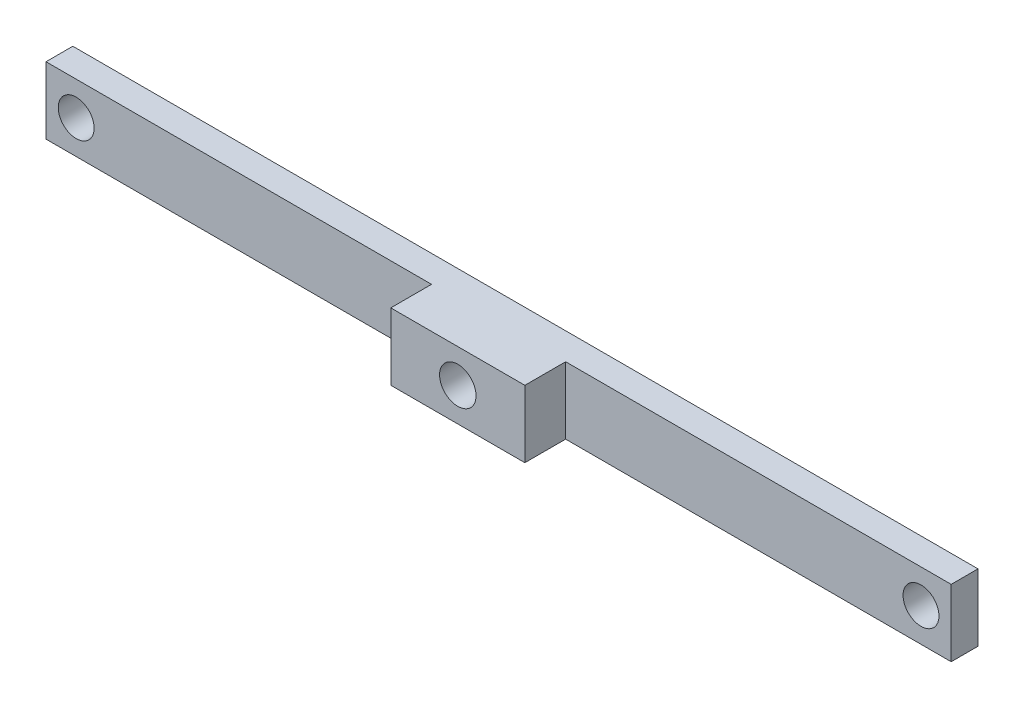
ISO-10303-21;
HEADER;
FILE_DESCRIPTION(('STEP AP214'),'2;1');
FILE_NAME('part.step','',(''),(''),'','','');
FILE_SCHEMA(('AUTOMOTIVE_DESIGN { 1 0 10303 214 1 1 1 1 }'));
ENDSEC;
DATA;
#1=APPLICATION_CONTEXT('core data for automotive mechanical design processes');
#2=APPLICATION_PROTOCOL_DEFINITION('international standard','automotive_design',2000,#1);
#3=PRODUCT_CONTEXT('',#1,'mechanical');
#4=PRODUCT('Part','Part','',(#3));
#5=PRODUCT_RELATED_PRODUCT_CATEGORY('part','',(#4));
#6=PRODUCT_DEFINITION_FORMATION('','',#4);
#7=PRODUCT_DEFINITION_CONTEXT('part definition',#1,'design');
#8=PRODUCT_DEFINITION('design','',#6,#7);
#9=PRODUCT_DEFINITION_SHAPE('','',#8);
#10=(LENGTH_UNIT() NAMED_UNIT(*) SI_UNIT(.MILLI.,.METRE.));
#11=(NAMED_UNIT(*) PLANE_ANGLE_UNIT() SI_UNIT($,.RADIAN.));
#12=(NAMED_UNIT(*) SI_UNIT($,.STERADIAN.) SOLID_ANGLE_UNIT());
#13=UNCERTAINTY_MEASURE_WITH_UNIT(LENGTH_MEASURE(1.E-05),#10,'distance_accuracy_value','');
#14=(GEOMETRIC_REPRESENTATION_CONTEXT(3) GLOBAL_UNCERTAINTY_ASSIGNED_CONTEXT((#13)) GLOBAL_UNIT_ASSIGNED_CONTEXT((#10,
#11,#12)) REPRESENTATION_CONTEXT('',''));
#15=CARTESIAN_POINT('',(0.,0.,0.));
#16=DIRECTION('',(0.,0.,1.));
#17=DIRECTION('',(1.,0.,0.));
#18=AXIS2_PLACEMENT_3D('',#15,#16,#17);
#19=CARTESIAN_POINT('',(42.8625,3.175,0.));
#20=DIRECTION('',(0.,0.,-1.));
#21=DIRECTION('',(-1.,0.,0.));
#22=AXIS2_PLACEMENT_3D('',#19,#20,#21);
#23=PLANE('',#22);
#24=DIRECTION('',(0.,1.,0.));
#25=VECTOR('',#24,1.);
#26=CARTESIAN_POINT('',(42.8625,-3.175,0.));
#27=LINE('',#26,#25);
#28=CARTESIAN_POINT('',(42.8625,-3.175,0.));
#29=VERTEX_POINT('',#28);
#30=CARTESIAN_POINT('',(42.8625,3.175,0.));
#31=VERTEX_POINT('',#30);
#32=EDGE_CURVE('E162',#29,#31,#27,.T.);
#33=ORIENTED_EDGE('',*,*,#32,.F.);
#34=DIRECTION('',(1.,0.,0.));
#35=VECTOR('',#34,1.);
#36=CARTESIAN_POINT('',(-42.8625,-3.175,0.));
#37=LINE('',#36,#35);
#38=CARTESIAN_POINT('',(-42.8625,-3.175,0.));
#39=VERTEX_POINT('',#38);
#40=EDGE_CURVE('E179',#39,#29,#37,.T.);
#41=ORIENTED_EDGE('',*,*,#40,.F.);
#42=DIRECTION('',(0.,-1.,0.));
#43=VECTOR('',#42,1.);
#44=CARTESIAN_POINT('',(-42.8625,-3.175,0.));
#45=LINE('',#44,#43);
#46=CARTESIAN_POINT('',(-42.8625,3.175,0.));
#47=VERTEX_POINT('',#46);
#48=EDGE_CURVE('E189',#47,#39,#45,.T.);
#49=ORIENTED_EDGE('',*,*,#48,.F.);
#50=DIRECTION('',(-1.,0.,0.));
#51=VECTOR('',#50,1.);
#52=CARTESIAN_POINT('',(-42.8625,3.175,0.));
#53=LINE('',#52,#51);
#54=EDGE_CURVE('E185',#31,#47,#53,.T.);
#55=ORIENTED_EDGE('',*,*,#54,.F.);
#56=EDGE_LOOP('',(#33,#41,#49,#55));
#57=FACE_BOUND('',#56,.T.);
#58=CARTESIAN_POINT('',(40.005,0.,0.));
#59=DIRECTION('',(0.,0.,1.));
#60=DIRECTION('',(1.,0.,0.));
#61=AXIS2_PLACEMENT_3D('',#58,#59,#60);
#62=CIRCLE('',#61,1.7);
#63=CARTESIAN_POINT('',(41.705,0.,0.));
#64=VERTEX_POINT('',#63);
#65=EDGE_CURVE('E150',#64,#64,#62,.T.);
#66=ORIENTED_EDGE('',*,*,#65,.T.);
#67=EDGE_LOOP('',(#66));
#68=FACE_BOUND('',#67,.T.);
#69=CARTESIAN_POINT('',(-40.005,0.,0.));
#70=DIRECTION('',(0.,0.,1.));
#71=DIRECTION('',(1.,0.,0.));
#72=AXIS2_PLACEMENT_3D('',#69,#70,#71);
#73=CIRCLE('',#72,1.7);
#74=CARTESIAN_POINT('',(-38.305,0.,0.));
#75=VERTEX_POINT('',#74);
#76=EDGE_CURVE('E266',#75,#75,#73,.T.);
#77=ORIENTED_EDGE('',*,*,#76,.T.);
#78=EDGE_LOOP('',(#77));
#79=FACE_BOUND('',#78,.T.);
#80=CARTESIAN_POINT('',(0.,0.,0.));
#81=DIRECTION('',(0.,0.,1.));
#82=DIRECTION('',(1.,0.,0.));
#83=AXIS2_PLACEMENT_3D('',#80,#81,#82);
#84=CIRCLE('',#83,1.7272);
#85=CARTESIAN_POINT('',(1.7272,0.,0.));
#86=VERTEX_POINT('',#85);
#87=EDGE_CURVE('E257',#86,#86,#84,.T.);
#88=ORIENTED_EDGE('',*,*,#87,.T.);
#89=EDGE_LOOP('',(#88));
#90=FACE_BOUND('',#89,.T.);
#91=ADVANCED_FACE('F44',(#57,#68,#79,#90),#23,.T.);
#92=CARTESIAN_POINT('',(-42.8625,3.175,6.40182));
#93=DIRECTION('',(0.,-1.,0.));
#94=DIRECTION('',(0.,0.,-1.));
#95=AXIS2_PLACEMENT_3D('',#92,#93,#94);
#96=PLANE('',#95);
#97=DIRECTION('',(0.,0.,1.));
#98=VECTOR('',#97,1.);
#99=CARTESIAN_POINT('',(-6.35,3.175,-37.0605606575238));
#100=LINE('',#99,#98);
#101=CARTESIAN_POINT('',(-6.35,3.175,2.53999999999999));
#102=VERTEX_POINT('',#101);
#103=CARTESIAN_POINT('',(-6.35,3.175,6.40182));
#104=VERTEX_POINT('',#103);
#105=EDGE_CURVE('E131',#102,#104,#100,.T.);
#106=ORIENTED_EDGE('',*,*,#105,.T.);
#107=DIRECTION('',(-1.,0.,0.));
#108=VECTOR('',#107,1.);
#109=CARTESIAN_POINT('',(-42.8625,3.175,6.40182));
#110=LINE('',#109,#108);
#111=CARTESIAN_POINT('',(6.35,3.175,6.40182));
#112=VERTEX_POINT('',#111);
#113=EDGE_CURVE('E175',#112,#104,#110,.T.);
#114=ORIENTED_EDGE('',*,*,#113,.F.);
#115=DIRECTION('',(0.,0.,1.));
#116=VECTOR('',#115,1.);
#117=CARTESIAN_POINT('',(6.35,3.175,-37.0605606575238));
#118=LINE('',#117,#116);
#119=CARTESIAN_POINT('',(6.35,3.175,2.53999999999999));
#120=VERTEX_POINT('',#119);
#121=EDGE_CURVE('E72',#120,#112,#118,.T.);
#122=ORIENTED_EDGE('',*,*,#121,.F.);
#123=DIRECTION('',(-1.,0.,0.));
#124=VECTOR('',#123,1.);
#125=CARTESIAN_POINT('',(42.8625,3.175,2.54));
#126=LINE('',#125,#124);
#127=CARTESIAN_POINT('',(42.8625,3.175,2.54));
#128=VERTEX_POINT('',#127);
#129=EDGE_CURVE('E156',#128,#120,#126,.T.);
#130=ORIENTED_EDGE('',*,*,#129,.F.);
#131=DIRECTION('',(0.,0.,-1.));
#132=VECTOR('',#131,1.);
#133=CARTESIAN_POINT('',(42.8625,3.175,6.40182));
#134=LINE('',#133,#132);
#135=EDGE_CURVE('E12',#128,#31,#134,.T.);
#136=ORIENTED_EDGE('',*,*,#135,.T.);
#137=ORIENTED_EDGE('',*,*,#54,.T.);
#138=DIRECTION('',(0.,0.,-1.));
#139=VECTOR('',#138,1.);
#140=CARTESIAN_POINT('',(-42.8625,3.175,6.40182));
#141=LINE('',#140,#139);
#142=CARTESIAN_POINT('',(-42.8625,3.175,2.53999999999999));
#143=VERTEX_POINT('',#142);
#144=EDGE_CURVE('E52',#143,#47,#141,.T.);
#145=ORIENTED_EDGE('',*,*,#144,.F.);
#146=DIRECTION('',(1.,0.,0.));
#147=VECTOR('',#146,1.);
#148=CARTESIAN_POINT('',(-42.8625,3.175,2.54));
#149=LINE('',#148,#147);
#150=EDGE_CURVE('E135',#143,#102,#149,.T.);
#151=ORIENTED_EDGE('',*,*,#150,.T.);
#152=EDGE_LOOP('',(#106,#114,#122,#130,#136,#137,#145,#151));
#153=FACE_BOUND('',#152,.T.);
#154=ADVANCED_FACE('F206',(#153),#96,.F.);
#155=CARTESIAN_POINT('',(-42.8625,-3.175,6.40182));
#156=DIRECTION('',(0.,1.,0.));
#157=DIRECTION('',(0.,0.,1.));
#158=AXIS2_PLACEMENT_3D('',#155,#156,#157);
#159=PLANE('',#158);
#160=DIRECTION('',(0.,0.,1.));
#161=VECTOR('',#160,1.);
#162=CARTESIAN_POINT('',(-6.35,-3.175,-37.0605606575238));
#163=LINE('',#162,#161);
#164=CARTESIAN_POINT('',(-6.35,-3.175,2.53999999999999));
#165=VERTEX_POINT('',#164);
#166=CARTESIAN_POINT('',(-6.35,-3.175,6.40182));
#167=VERTEX_POINT('',#166);
#168=EDGE_CURVE('E62',#165,#167,#163,.T.);
#169=ORIENTED_EDGE('',*,*,#168,.F.);
#170=DIRECTION('',(-1.,0.,0.));
#171=VECTOR('',#170,1.);
#172=CARTESIAN_POINT('',(-42.8625,-3.175,2.54));
#173=LINE('',#172,#171);
#174=CARTESIAN_POINT('',(-42.8625,-3.175,2.54));
#175=VERTEX_POINT('',#174);
#176=EDGE_CURVE('E119',#165,#175,#173,.T.);
#177=ORIENTED_EDGE('',*,*,#176,.T.);
#178=DIRECTION('',(0.,0.,-1.));
#179=VECTOR('',#178,1.);
#180=CARTESIAN_POINT('',(-42.8625,-3.175,6.40182));
#181=LINE('',#180,#179);
#182=EDGE_CURVE('E197',#175,#39,#181,.T.);
#183=ORIENTED_EDGE('',*,*,#182,.T.);
#184=ORIENTED_EDGE('',*,*,#40,.T.);
#185=DIRECTION('',(0.,0.,-1.));
#186=VECTOR('',#185,1.);
#187=CARTESIAN_POINT('',(42.8625,-3.175,6.40182));
#188=LINE('',#187,#186);
#189=CARTESIAN_POINT('',(42.8625,-3.175,2.54));
#190=VERTEX_POINT('',#189);
#191=EDGE_CURVE('E182',#190,#29,#188,.T.);
#192=ORIENTED_EDGE('',*,*,#191,.F.);
#193=DIRECTION('',(1.,0.,0.));
#194=VECTOR('',#193,1.);
#195=CARTESIAN_POINT('',(42.8625,-3.175,2.54));
#196=LINE('',#195,#194);
#197=CARTESIAN_POINT('',(6.35,-3.175,2.54));
#198=VERTEX_POINT('',#197);
#199=EDGE_CURVE('E163',#198,#190,#196,.T.);
#200=ORIENTED_EDGE('',*,*,#199,.F.);
#201=DIRECTION('',(0.,0.,1.));
#202=VECTOR('',#201,1.);
#203=CARTESIAN_POINT('',(6.35,-3.175,-37.0605606575238));
#204=LINE('',#203,#202);
#205=CARTESIAN_POINT('',(6.35,-3.175,6.40182));
#206=VERTEX_POINT('',#205);
#207=EDGE_CURVE('E166',#198,#206,#204,.T.);
#208=ORIENTED_EDGE('',*,*,#207,.T.);
#209=DIRECTION('',(1.,0.,0.));
#210=VECTOR('',#209,1.);
#211=CARTESIAN_POINT('',(-42.8625,-3.175,6.40182));
#212=LINE('',#211,#210);
#213=EDGE_CURVE('E140',#167,#206,#212,.T.);
#214=ORIENTED_EDGE('',*,*,#213,.F.);
#215=EDGE_LOOP('',(#169,#177,#183,#184,#192,#200,#208,#214));
#216=FACE_BOUND('',#215,.T.);
#217=ADVANCED_FACE('F138',(#216),#159,.F.);
#218=CARTESIAN_POINT('',(42.8625,3.175,6.40182));
#219=DIRECTION('',(0.,0.,-1.));
#220=DIRECTION('',(-1.,0.,0.));
#221=AXIS2_PLACEMENT_3D('',#218,#219,#220);
#222=PLANE('',#221);
#223=CARTESIAN_POINT('',(0.,0.,6.40182));
#224=DIRECTION('',(0.,0.,1.));
#225=DIRECTION('',(1.,0.,0.));
#226=AXIS2_PLACEMENT_3D('',#223,#224,#225);
#227=CIRCLE('',#226,1.72719999999999);
#228=CARTESIAN_POINT('',(1.72719999999999,0.,6.40182));
#229=VERTEX_POINT('',#228);
#230=EDGE_CURVE('E254',#229,#229,#227,.T.);
#231=ORIENTED_EDGE('',*,*,#230,.F.);
#232=EDGE_LOOP('',(#231));
#233=FACE_BOUND('',#232,.T.);
#234=DIRECTION('',(0.,-1.,0.));
#235=VECTOR('',#234,1.);
#236=CARTESIAN_POINT('',(-6.35,3.175,6.40182));
#237=LINE('',#236,#235);
#238=EDGE_CURVE('E142',#104,#167,#237,.T.);
#239=ORIENTED_EDGE('',*,*,#238,.T.);
#240=ORIENTED_EDGE('',*,*,#213,.T.);
#241=DIRECTION('',(0.,-1.,0.));
#242=VECTOR('',#241,1.);
#243=CARTESIAN_POINT('',(6.35,3.175,6.40182));
#244=LINE('',#243,#242);
#245=EDGE_CURVE('E153',#112,#206,#244,.T.);
#246=ORIENTED_EDGE('',*,*,#245,.F.);
#247=ORIENTED_EDGE('',*,*,#113,.T.);
#248=EDGE_LOOP('',(#239,#240,#246,#247));
#249=FACE_BOUND('',#248,.T.);
#250=ADVANCED_FACE('F220',(#233,#249),#222,.F.);
#251=CARTESIAN_POINT('',(42.8625,-3.175,6.40182));
#252=DIRECTION('',(-1.,0.,0.));
#253=DIRECTION('',(0.,0.,1.));
#254=AXIS2_PLACEMENT_3D('',#251,#252,#253);
#255=PLANE('',#254);
#256=ORIENTED_EDGE('',*,*,#135,.F.);
#257=DIRECTION('',(0.,1.,0.));
#258=VECTOR('',#257,1.);
#259=CARTESIAN_POINT('',(42.8625,3.175,2.54));
#260=LINE('',#259,#258);
#261=EDGE_CURVE('E160',#190,#128,#260,.T.);
#262=ORIENTED_EDGE('',*,*,#261,.F.);
#263=ORIENTED_EDGE('',*,*,#191,.T.);
#264=ORIENTED_EDGE('',*,*,#32,.T.);
#265=EDGE_LOOP('',(#256,#262,#263,#264));
#266=FACE_BOUND('',#265,.T.);
#267=ADVANCED_FACE('F46',(#266),#255,.F.);
#268=CARTESIAN_POINT('',(-42.8625,-3.175,6.40182));
#269=DIRECTION('',(1.,0.,0.));
#270=DIRECTION('',(0.,0.,-1.));
#271=AXIS2_PLACEMENT_3D('',#268,#269,#270);
#272=PLANE('',#271);
#273=ORIENTED_EDGE('',*,*,#182,.F.);
#274=DIRECTION('',(0.,1.,0.));
#275=VECTOR('',#274,1.);
#276=CARTESIAN_POINT('',(-42.8625,3.175,2.54));
#277=LINE('',#276,#275);
#278=EDGE_CURVE('E124',#175,#143,#277,.T.);
#279=ORIENTED_EDGE('',*,*,#278,.T.);
#280=ORIENTED_EDGE('',*,*,#144,.T.);
#281=ORIENTED_EDGE('',*,*,#48,.T.);
#282=EDGE_LOOP('',(#273,#279,#280,#281));
#283=FACE_BOUND('',#282,.T.);
#284=ADVANCED_FACE('F201',(#283),#272,.F.);
#285=CARTESIAN_POINT('',(42.8625,3.175,2.54));
#286=DIRECTION('',(0.,0.,-1.));
#287=DIRECTION('',(-1.,0.,0.));
#288=AXIS2_PLACEMENT_3D('',#285,#286,#287);
#289=PLANE('',#288);
#290=CARTESIAN_POINT('',(40.005,0.,2.54));
#291=DIRECTION('',(0.,0.,1.));
#292=DIRECTION('',(1.,0.,0.));
#293=AXIS2_PLACEMENT_3D('',#290,#291,#292);
#294=CIRCLE('',#293,1.69999999999999);
#295=CARTESIAN_POINT('',(41.705,0.,2.54));
#296=VERTEX_POINT('',#295);
#297=EDGE_CURVE('E134',#296,#296,#294,.T.);
#298=ORIENTED_EDGE('',*,*,#297,.F.);
#299=EDGE_LOOP('',(#298));
#300=FACE_BOUND('',#299,.T.);
#301=ORIENTED_EDGE('',*,*,#261,.T.);
#302=ORIENTED_EDGE('',*,*,#129,.T.);
#303=DIRECTION('',(0.,-1.,0.));
#304=VECTOR('',#303,1.);
#305=CARTESIAN_POINT('',(6.35,3.175,2.54));
#306=LINE('',#305,#304);
#307=EDGE_CURVE('E167',#120,#198,#306,.T.);
#308=ORIENTED_EDGE('',*,*,#307,.T.);
#309=ORIENTED_EDGE('',*,*,#199,.T.);
#310=EDGE_LOOP('',(#301,#302,#308,#309));
#311=FACE_BOUND('',#310,.T.);
#312=ADVANCED_FACE('F217',(#300,#311),#289,.F.);
#313=CARTESIAN_POINT('',(6.35,3.175,-37.0605606575238));
#314=DIRECTION('',(-1.,0.,0.));
#315=DIRECTION('',(0.,0.,1.));
#316=AXIS2_PLACEMENT_3D('',#313,#314,#315);
#317=PLANE('',#316);
#318=ORIENTED_EDGE('',*,*,#121,.T.);
#319=ORIENTED_EDGE('',*,*,#245,.T.);
#320=ORIENTED_EDGE('',*,*,#207,.F.);
#321=ORIENTED_EDGE('',*,*,#307,.F.);
#322=EDGE_LOOP('',(#318,#319,#320,#321));
#323=FACE_BOUND('',#322,.T.);
#324=ADVANCED_FACE('F221',(#323),#317,.F.);
#325=CARTESIAN_POINT('',(40.005,0.,2.54));
#326=DIRECTION('',(0.,0.,1.));
#327=DIRECTION('',(1.,0.,0.));
#328=AXIS2_PLACEMENT_3D('',#325,#326,#327);
#329=CYLINDRICAL_SURFACE('',#328,1.69999999999999);
#330=ORIENTED_EDGE('',*,*,#65,.F.);
#331=EDGE_LOOP('',(#330));
#332=FACE_BOUND('',#331,.T.);
#333=ORIENTED_EDGE('',*,*,#297,.T.);
#334=EDGE_LOOP('',(#333));
#335=FACE_BOUND('',#334,.T.);
#336=ADVANCED_FACE('F223',(#332,#335),#329,.F.);
#337=CARTESIAN_POINT('',(-6.35,3.175,-37.0605606575238));
#338=DIRECTION('',(-1.,0.,0.));
#339=DIRECTION('',(0.,0.,1.));
#340=AXIS2_PLACEMENT_3D('',#337,#338,#339);
#341=PLANE('',#340);
#342=DIRECTION('',(0.,-1.,0.));
#343=VECTOR('',#342,1.);
#344=CARTESIAN_POINT('',(-6.35,3.175,2.54));
#345=LINE('',#344,#343);
#346=EDGE_CURVE('E121',#102,#165,#345,.T.);
#347=ORIENTED_EDGE('',*,*,#346,.T.);
#348=ORIENTED_EDGE('',*,*,#168,.T.);
#349=ORIENTED_EDGE('',*,*,#238,.F.);
#350=ORIENTED_EDGE('',*,*,#105,.F.);
#351=EDGE_LOOP('',(#347,#348,#349,#350));
#352=FACE_BOUND('',#351,.T.);
#353=ADVANCED_FACE('F129',(#352),#341,.T.);
#354=CARTESIAN_POINT('',(42.8625,3.175,2.54));
#355=DIRECTION('',(0.,0.,-1.));
#356=DIRECTION('',(-1.,0.,0.));
#357=AXIS2_PLACEMENT_3D('',#354,#355,#356);
#358=PLANE('',#357);
#359=CARTESIAN_POINT('',(-40.005,0.,2.54));
#360=DIRECTION('',(0.,0.,1.));
#361=DIRECTION('',(1.,0.,0.));
#362=AXIS2_PLACEMENT_3D('',#359,#360,#361);
#363=CIRCLE('',#362,1.69999999999999);
#364=CARTESIAN_POINT('',(-38.305,0.,2.54));
#365=VERTEX_POINT('',#364);
#366=EDGE_CURVE('E261',#365,#365,#363,.T.);
#367=ORIENTED_EDGE('',*,*,#366,.F.);
#368=EDGE_LOOP('',(#367));
#369=FACE_BOUND('',#368,.T.);
#370=ORIENTED_EDGE('',*,*,#176,.F.);
#371=ORIENTED_EDGE('',*,*,#346,.F.);
#372=ORIENTED_EDGE('',*,*,#150,.F.);
#373=ORIENTED_EDGE('',*,*,#278,.F.);
#374=EDGE_LOOP('',(#370,#371,#372,#373));
#375=FACE_BOUND('',#374,.T.);
#376=ADVANCED_FACE('F120',(#369,#375),#358,.F.);
#377=CARTESIAN_POINT('',(-40.005,0.,2.54));
#378=DIRECTION('',(0.,0.,1.));
#379=DIRECTION('',(1.,0.,0.));
#380=AXIS2_PLACEMENT_3D('',#377,#378,#379);
#381=CYLINDRICAL_SURFACE('',#380,1.69999999999999);
#382=ORIENTED_EDGE('',*,*,#76,.F.);
#383=EDGE_LOOP('',(#382));
#384=FACE_BOUND('',#383,.T.);
#385=ORIENTED_EDGE('',*,*,#366,.T.);
#386=EDGE_LOOP('',(#385));
#387=FACE_BOUND('',#386,.T.);
#388=ADVANCED_FACE('F277',(#384,#387),#381,.F.);
#389=CARTESIAN_POINT('',(0.,0.,6.40182));
#390=DIRECTION('',(0.,0.,1.));
#391=DIRECTION('',(1.,0.,0.));
#392=AXIS2_PLACEMENT_3D('',#389,#390,#391);
#393=CYLINDRICAL_SURFACE('',#392,1.72719999999999);
#394=ORIENTED_EDGE('',*,*,#87,.F.);
#395=EDGE_LOOP('',(#394));
#396=FACE_BOUND('',#395,.T.);
#397=ORIENTED_EDGE('',*,*,#230,.T.);
#398=EDGE_LOOP('',(#397));
#399=FACE_BOUND('',#398,.T.);
#400=ADVANCED_FACE('F280',(#396,#399),#393,.F.);
#401=CLOSED_SHELL('',(#91,#154,#217,#250,#267,#284,#312,#324,#336,#353,#376,#388,#400));
#402=MANIFOLD_SOLID_BREP('B2',#401);
#403=ADVANCED_BREP_SHAPE_REPRESENTATION('',(#18,#402),#14);
#404=SHAPE_DEFINITION_REPRESENTATION(#9,#403);
ENDSEC;
END-ISO-10303-21;
